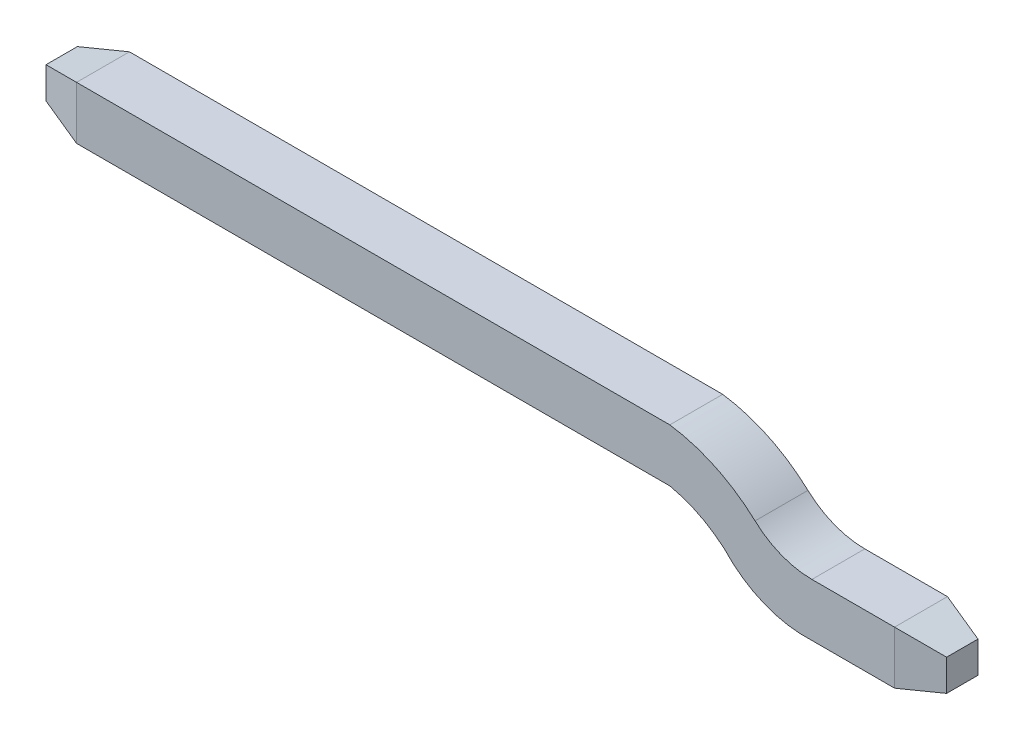
ISO-10303-21;
HEADER;
FILE_DESCRIPTION(('STEP AP214'),'2;1');
FILE_NAME('part.step','',(''),(''),'','','');
FILE_SCHEMA(('AUTOMOTIVE_DESIGN { 1 0 10303 214 1 1 1 1 }'));
ENDSEC;
DATA;
#1=APPLICATION_CONTEXT('core data for automotive mechanical design processes');
#2=APPLICATION_PROTOCOL_DEFINITION('international standard','automotive_design',2000,#1);
#3=PRODUCT_CONTEXT('',#1,'mechanical');
#4=PRODUCT('Part','Part','',(#3));
#5=PRODUCT_RELATED_PRODUCT_CATEGORY('part','',(#4));
#6=PRODUCT_DEFINITION_FORMATION('','',#4);
#7=PRODUCT_DEFINITION_CONTEXT('part definition',#1,'design');
#8=PRODUCT_DEFINITION('design','',#6,#7);
#9=PRODUCT_DEFINITION_SHAPE('','',#8);
#10=(LENGTH_UNIT() NAMED_UNIT(*) SI_UNIT(.MILLI.,.METRE.));
#11=(NAMED_UNIT(*) PLANE_ANGLE_UNIT() SI_UNIT($,.RADIAN.));
#12=(NAMED_UNIT(*) SI_UNIT($,.STERADIAN.) SOLID_ANGLE_UNIT());
#13=UNCERTAINTY_MEASURE_WITH_UNIT(LENGTH_MEASURE(1.E-05),#10,'distance_accuracy_value','');
#14=(GEOMETRIC_REPRESENTATION_CONTEXT(3) GLOBAL_UNCERTAINTY_ASSIGNED_CONTEXT((#13)) GLOBAL_UNIT_ASSIGNED_CONTEXT((#10,
#11,#12)) REPRESENTATION_CONTEXT('',''));
#15=CARTESIAN_POINT('',(0.,0.,0.));
#16=DIRECTION('',(0.,0.,1.));
#17=DIRECTION('',(1.,0.,0.));
#18=AXIS2_PLACEMENT_3D('',#15,#16,#17);
#19=CARTESIAN_POINT('',(0.,0.64,0.13));
#20=DIRECTION('',(-0.251633851765063,0.,-0.967822506788243));
#21=DIRECTION('',(-0.967822506788243,0.,0.251633851765063));
#22=AXIS2_PLACEMENT_3D('',#19,#20,#21);
#23=PLANE('',#22);
#24=DIRECTION('',(-0.938563819722819,0.244026593128049,0.24402659312794));
#25=VECTOR('',#24,1.);
#26=CARTESIAN_POINT('',(0.5,0.,0.));
#27=LINE('',#26,#25);
#28=CARTESIAN_POINT('',(0.5,0.,0.));
#29=VERTEX_POINT('',#28);
#30=CARTESIAN_POINT('',(0.,0.130000000000039,0.13));
#31=VERTEX_POINT('',#30);
#32=EDGE_CURVE('E157',#29,#31,#27,.T.);
#33=ORIENTED_EDGE('',*,*,#32,.T.);
#34=DIRECTION('',(0.,1.,0.));
#35=VECTOR('',#34,1.);
#36=CARTESIAN_POINT('',(0.,0.64,0.13));
#37=LINE('',#36,#35);
#38=CARTESIAN_POINT('',(0.,0.51,0.13));
#39=VERTEX_POINT('',#38);
#40=EDGE_CURVE('E173',#31,#39,#37,.T.);
#41=ORIENTED_EDGE('',*,*,#40,.T.);
#42=DIRECTION('',(0.938563819722819,0.244026593128049,-0.24402659312794));
#43=VECTOR('',#42,1.);
#44=CARTESIAN_POINT('',(0.,0.51,0.13));
#45=LINE('',#44,#43);
#46=CARTESIAN_POINT('',(0.499999999999996,0.640000000000015,0.));
#47=VERTEX_POINT('',#46);
#48=EDGE_CURVE('E146',#39,#47,#45,.T.);
#49=ORIENTED_EDGE('',*,*,#48,.T.);
#50=DIRECTION('',(0.,1.,0.));
#51=VECTOR('',#50,1.);
#52=CARTESIAN_POINT('',(0.5,0.583183016042,0.));
#53=LINE('',#52,#51);
#54=EDGE_CURVE('E144',#29,#47,#53,.T.);
#55=ORIENTED_EDGE('',*,*,#54,.F.);
#56=EDGE_LOOP('',(#33,#41,#49,#55));
#57=FACE_BOUND('',#56,.T.);
#58=ADVANCED_FACE('F17',(#57),#23,.T.);
#59=CARTESIAN_POINT('',(10.9,-0.76,0.13));
#60=DIRECTION('',(0.251633851765063,0.,-0.967822506788243));
#61=DIRECTION('',(-0.967822506788243,0.,-0.251633851765063));
#62=AXIS2_PLACEMENT_3D('',#59,#60,#61);
#63=PLANE('',#62);
#64=DIRECTION('',(-0.938563819722819,-0.244026593128049,-0.244026593127941));
#65=VECTOR('',#64,1.);
#66=CARTESIAN_POINT('',(10.9,-0.63,0.13));
#67=LINE('',#66,#65);
#68=CARTESIAN_POINT('',(10.9,-0.63,0.13));
#69=VERTEX_POINT('',#68);
#70=CARTESIAN_POINT('',(10.4,-0.760000000000015,0.));
#71=VERTEX_POINT('',#70);
#72=EDGE_CURVE('E192',#69,#71,#67,.T.);
#73=ORIENTED_EDGE('',*,*,#72,.T.);
#74=DIRECTION('',(0.,1.,0.));
#75=VECTOR('',#74,1.);
#76=CARTESIAN_POINT('',(10.4,0.583183016042,0.));
#77=LINE('',#76,#75);
#78=CARTESIAN_POINT('',(10.4,-0.12,0.));
#79=VERTEX_POINT('',#78);
#80=EDGE_CURVE('E126',#79,#71,#77,.F.);
#81=ORIENTED_EDGE('',*,*,#80,.F.);
#82=DIRECTION('',(0.938563819722819,-0.244026593128049,0.244026593127941));
#83=VECTOR('',#82,1.);
#84=CARTESIAN_POINT('',(10.4,-0.12,0.));
#85=LINE('',#84,#83);
#86=CARTESIAN_POINT('',(10.9,-0.250000000000038,0.13));
#87=VERTEX_POINT('',#86);
#88=EDGE_CURVE('E201',#79,#87,#85,.T.);
#89=ORIENTED_EDGE('',*,*,#88,.T.);
#90=DIRECTION('',(0.,1.,0.));
#91=VECTOR('',#90,1.);
#92=CARTESIAN_POINT('',(10.9,-0.76,0.13));
#93=LINE('',#92,#91);
#94=EDGE_CURVE('E202',#87,#69,#93,.F.);
#95=ORIENTED_EDGE('',*,*,#94,.T.);
#96=EDGE_LOOP('',(#73,#81,#89,#95));
#97=FACE_BOUND('',#96,.T.);
#98=ADVANCED_FACE('F347',(#97),#63,.T.);
#99=CARTESIAN_POINT('',(10.9,-0.76,0.64));
#100=DIRECTION('',(-1.,0.,0.));
#101=DIRECTION('',(0.,0.,1.));
#102=AXIS2_PLACEMENT_3D('',#99,#100,#101);
#103=PLANE('',#102);
#104=DIRECTION('',(0.,0.,1.));
#105=VECTOR('',#104,1.);
#106=CARTESIAN_POINT('',(10.9,-0.63,0.64));
#107=LINE('',#106,#105);
#108=CARTESIAN_POINT('',(10.9,-0.63,0.509999999999942));
#109=VERTEX_POINT('',#108);
#110=EDGE_CURVE('E195',#109,#69,#107,.F.);
#111=ORIENTED_EDGE('',*,*,#110,.T.);
#112=ORIENTED_EDGE('',*,*,#94,.F.);
#113=DIRECTION('',(0.,0.,1.));
#114=VECTOR('',#113,1.);
#115=CARTESIAN_POINT('',(10.9,-0.250000000000058,0.64));
#116=LINE('',#115,#114);
#117=CARTESIAN_POINT('',(10.9,-0.250000000000019,0.509999999999942));
#118=VERTEX_POINT('',#117);
#119=EDGE_CURVE('E198',#87,#118,#116,.T.);
#120=ORIENTED_EDGE('',*,*,#119,.T.);
#121=DIRECTION('',(0.,1.,0.));
#122=VECTOR('',#121,1.);
#123=CARTESIAN_POINT('',(10.9,0.583183016042,0.509999999999942));
#124=LINE('',#123,#122);
#125=EDGE_CURVE('E205',#118,#109,#124,.F.);
#126=ORIENTED_EDGE('',*,*,#125,.T.);
#127=EDGE_LOOP('',(#111,#112,#120,#126));
#128=FACE_BOUND('',#127,.T.);
#129=ADVANCED_FACE('F345',(#128),#103,.F.);
#130=CARTESIAN_POINT('',(10.4,-0.12,0.64));
#131=DIRECTION('',(-0.251633851765063,-0.967822506788243,0.));
#132=DIRECTION('',(0.967822506788243,-0.251633851765063,0.));
#133=AXIS2_PLACEMENT_3D('',#130,#131,#132);
#134=PLANE('',#133);
#135=DIRECTION('',(0.,0.,1.));
#136=VECTOR('',#135,1.);
#137=CARTESIAN_POINT('',(10.4,-0.12,0.64));
#138=LINE('',#137,#136);
#139=CARTESIAN_POINT('',(10.4,-0.12,0.64));
#140=VERTEX_POINT('',#139);
#141=EDGE_CURVE('E209',#79,#140,#138,.T.);
#142=ORIENTED_EDGE('',*,*,#141,.T.);
#143=DIRECTION('',(0.938563819722819,-0.244026593127941,-0.244026593128049));
#144=VECTOR('',#143,1.);
#145=CARTESIAN_POINT('',(10.4,-0.12,0.64));
#146=LINE('',#145,#144);
#147=EDGE_CURVE('E256',#140,#118,#146,.T.);
#148=ORIENTED_EDGE('',*,*,#147,.T.);
#149=ORIENTED_EDGE('',*,*,#119,.F.);
#150=ORIENTED_EDGE('',*,*,#88,.F.);
#151=EDGE_LOOP('',(#142,#148,#149,#150));
#152=FACE_BOUND('',#151,.T.);
#153=ADVANCED_FACE('F276',(#152),#134,.F.);
#154=CARTESIAN_POINT('',(10.9,-0.63,0.64));
#155=DIRECTION('',(-0.251633851765063,0.967822506788243,0.));
#156=DIRECTION('',(-0.967822506788243,-0.251633851765063,0.));
#157=AXIS2_PLACEMENT_3D('',#154,#155,#156);
#158=PLANE('',#157);
#159=DIRECTION('',(0.,0.,1.));
#160=VECTOR('',#159,1.);
#161=CARTESIAN_POINT('',(10.4,-0.76,0.64));
#162=LINE('',#161,#160);
#163=CARTESIAN_POINT('',(10.4,-0.76,0.64));
#164=VERTEX_POINT('',#163);
#165=EDGE_CURVE('E186',#164,#71,#162,.F.);
#166=ORIENTED_EDGE('',*,*,#165,.T.);
#167=ORIENTED_EDGE('',*,*,#72,.F.);
#168=ORIENTED_EDGE('',*,*,#110,.F.);
#169=DIRECTION('',(-0.938563819722819,-0.244026593127941,0.244026593128049));
#170=VECTOR('',#169,1.);
#171=CARTESIAN_POINT('',(10.9,-0.63,0.509999999999942));
#172=LINE('',#171,#170);
#173=EDGE_CURVE('E208',#109,#164,#172,.T.);
#174=ORIENTED_EDGE('',*,*,#173,.T.);
#175=EDGE_LOOP('',(#166,#167,#168,#174));
#176=FACE_BOUND('',#175,.T.);
#177=ADVANCED_FACE('F342',(#176),#158,.F.);
#178=CARTESIAN_POINT('',(0.,0.64,0.64));
#179=DIRECTION('',(1.,0.,0.));
#180=DIRECTION('',(0.,1.,0.));
#181=AXIS2_PLACEMENT_3D('',#178,#179,#180);
#182=PLANE('',#181);
#183=ORIENTED_EDGE('',*,*,#40,.F.);
#184=DIRECTION('',(0.,0.,1.));
#185=VECTOR('',#184,1.);
#186=CARTESIAN_POINT('',(0.,0.130000000000058,0.64));
#187=LINE('',#186,#185);
#188=CARTESIAN_POINT('',(0.,0.130000000000019,0.509999999999942));
#189=VERTEX_POINT('',#188);
#190=EDGE_CURVE('E154',#31,#189,#187,.T.);
#191=ORIENTED_EDGE('',*,*,#190,.T.);
#192=DIRECTION('',(0.,1.,0.));
#193=VECTOR('',#192,1.);
#194=CARTESIAN_POINT('',(0.,0.583183016042,0.509999999999942));
#195=LINE('',#194,#193);
#196=CARTESIAN_POINT('',(0.,0.51,0.509999999999942));
#197=VERTEX_POINT('',#196);
#198=EDGE_CURVE('E160',#189,#197,#195,.T.);
#199=ORIENTED_EDGE('',*,*,#198,.T.);
#200=DIRECTION('',(0.,0.,1.));
#201=VECTOR('',#200,1.);
#202=CARTESIAN_POINT('',(0.,0.51,0.64));
#203=LINE('',#202,#201);
#204=EDGE_CURVE('E151',#197,#39,#203,.F.);
#205=ORIENTED_EDGE('',*,*,#204,.T.);
#206=EDGE_LOOP('',(#183,#191,#199,#205));
#207=FACE_BOUND('',#206,.T.);
#208=ADVANCED_FACE('F467',(#207),#182,.F.);
#209=CARTESIAN_POINT('',(0.5,0.,0.64));
#210=DIRECTION('',(0.251633851765063,0.967822506788243,0.));
#211=DIRECTION('',(-0.967822506788243,0.251633851765063,0.));
#212=AXIS2_PLACEMENT_3D('',#209,#210,#211);
#213=PLANE('',#212);
#214=ORIENTED_EDGE('',*,*,#190,.F.);
#215=ORIENTED_EDGE('',*,*,#32,.F.);
#216=DIRECTION('',(0.,0.,1.));
#217=VECTOR('',#216,1.);
#218=CARTESIAN_POINT('',(0.5,0.,0.64));
#219=LINE('',#218,#217);
#220=CARTESIAN_POINT('',(0.5,0.,0.64));
#221=VERTEX_POINT('',#220);
#222=EDGE_CURVE('E164',#29,#221,#219,.T.);
#223=ORIENTED_EDGE('',*,*,#222,.T.);
#224=DIRECTION('',(-0.938563819722819,0.24402659312794,-0.244026593128049));
#225=VECTOR('',#224,1.);
#226=CARTESIAN_POINT('',(0.5,0.,0.64));
#227=LINE('',#226,#225);
#228=EDGE_CURVE('E299',#221,#189,#227,.T.);
#229=ORIENTED_EDGE('',*,*,#228,.T.);
#230=EDGE_LOOP('',(#214,#215,#223,#229));
#231=FACE_BOUND('',#230,.T.);
#232=ADVANCED_FACE('F321',(#231),#213,.F.);
#233=CARTESIAN_POINT('',(0.,0.51,0.64));
#234=DIRECTION('',(0.251633851765063,-0.967822506788243,0.));
#235=DIRECTION('',(0.967822506788243,0.251633851765063,0.));
#236=AXIS2_PLACEMENT_3D('',#233,#234,#235);
#237=PLANE('',#236);
#238=DIRECTION('',(0.,0.,1.));
#239=VECTOR('',#238,1.);
#240=CARTESIAN_POINT('',(0.5,0.64,0.64));
#241=LINE('',#240,#239);
#242=CARTESIAN_POINT('',(0.5,0.64,0.64));
#243=VERTEX_POINT('',#242);
#244=EDGE_CURVE('E34',#243,#47,#241,.F.);
#245=ORIENTED_EDGE('',*,*,#244,.T.);
#246=ORIENTED_EDGE('',*,*,#48,.F.);
#247=ORIENTED_EDGE('',*,*,#204,.F.);
#248=DIRECTION('',(0.938563819722819,0.24402659312794,0.244026593128049));
#249=VECTOR('',#248,1.);
#250=CARTESIAN_POINT('',(0.,0.51,0.509999999999942));
#251=LINE('',#250,#249);
#252=EDGE_CURVE('E163',#197,#243,#251,.T.);
#253=ORIENTED_EDGE('',*,*,#252,.T.);
#254=EDGE_LOOP('',(#245,#246,#247,#253));
#255=FACE_BOUND('',#254,.T.);
#256=ADVANCED_FACE('F451',(#255),#237,.F.);
#257=CARTESIAN_POINT('',(9.328387633986,0.583183016042,0.));
#258=DIRECTION('',(0.,0.,-1.));
#259=DIRECTION('',(-1.,0.,0.));
#260=AXIS2_PLACEMENT_3D('',#257,#258,#259);
#261=PLANE('',#260);
#262=CARTESIAN_POINT('',(9.328387633986,0.583183016042,0.));
#263=DIRECTION('',(0.,0.,-1.));
#264=DIRECTION('',(-1.,0.,0.));
#265=AXIS2_PLACEMENT_3D('',#262,#263,#264);
#266=CIRCLE('',#265,1.345090683021);
#267=CARTESIAN_POINT('',(8.44824054463188,-0.433974811756826,0.));
#268=VERTEX_POINT('',#267);
#269=CARTESIAN_POINT('',(9.40000000000033,-0.760000000000018,0.));
#270=VERTEX_POINT('',#269);
#271=EDGE_CURVE('E185',#268,#270,#266,.F.);
#272=ORIENTED_EDGE('',*,*,#271,.F.);
#273=CARTESIAN_POINT('',(7.376092966106,-1.434962408403,0.));
#274=DIRECTION('',(0.,0.,-1.));
#275=DIRECTION('',(-1.,0.,0.));
#276=AXIS2_PLACEMENT_3D('',#273,#274,#275);
#277=CIRCLE('',#276,1.466791259443);
#278=CARTESIAN_POINT('',(7.67999999999868,0.,0.));
#279=VERTEX_POINT('',#278);
#280=EDGE_CURVE('E242',#268,#279,#277,.F.);
#281=ORIENTED_EDGE('',*,*,#280,.T.);
#282=DIRECTION('',(1.,0.,0.));
#283=VECTOR('',#282,1.);
#284=CARTESIAN_POINT('',(0.,0.,0.));
#285=LINE('',#284,#283);
#286=EDGE_CURVE('E176',#279,#29,#285,.F.);
#287=ORIENTED_EDGE('',*,*,#286,.T.);
#288=ORIENTED_EDGE('',*,*,#54,.T.);
#289=DIRECTION('',(1.,0.,0.));
#290=VECTOR('',#289,1.);
#291=CARTESIAN_POINT('',(0.,0.64,0.));
#292=LINE('',#291,#290);
#293=CARTESIAN_POINT('',(7.6799999999997,0.640000000000001,0.));
#294=VERTEX_POINT('',#293);
#295=EDGE_CURVE('E120',#47,#294,#292,.T.);
#296=ORIENTED_EDGE('',*,*,#295,.T.);
#297=CARTESIAN_POINT('',(7.407807708896,-1.262382662351,0.));
#298=DIRECTION('',(0.,0.,-1.));
#299=DIRECTION('',(-1.,0.,0.));
#300=AXIS2_PLACEMENT_3D('',#297,#298,#299);
#301=CIRCLE('',#300,1.921756602005);
#302=CARTESIAN_POINT('',(8.71186119399857,0.14920968154378,0.));
#303=VERTEX_POINT('',#302);
#304=EDGE_CURVE('E20',#303,#294,#301,.F.);
#305=ORIENTED_EDGE('',*,*,#304,.F.);
#306=CARTESIAN_POINT('',(9.4,0.894095900695,0.));
#307=DIRECTION('',(0.,0.,-1.));
#308=DIRECTION('',(-1.,0.,0.));
#309=AXIS2_PLACEMENT_3D('',#306,#307,#308);
#310=CIRCLE('',#309,1.014095900695);
#311=CARTESIAN_POINT('',(9.4,-0.12,0.));
#312=VERTEX_POINT('',#311);
#313=EDGE_CURVE('E118',#303,#312,#310,.F.);
#314=ORIENTED_EDGE('',*,*,#313,.T.);
#315=DIRECTION('',(1.,0.,0.));
#316=VECTOR('',#315,1.);
#317=CARTESIAN_POINT('',(10.9,-0.12,0.));
#318=LINE('',#317,#316);
#319=EDGE_CURVE('E220',#312,#79,#318,.T.);
#320=ORIENTED_EDGE('',*,*,#319,.T.);
#321=ORIENTED_EDGE('',*,*,#80,.T.);
#322=DIRECTION('',(-1.,0.,0.));
#323=VECTOR('',#322,1.);
#324=CARTESIAN_POINT('',(10.9,-0.76,0.));
#325=LINE('',#324,#323);
#326=EDGE_CURVE('E182',#71,#270,#325,.T.);
#327=ORIENTED_EDGE('',*,*,#326,.T.);
#328=EDGE_LOOP('',(#272,#281,#287,#288,#296,#305,#314,#320,#321,#327));
#329=FACE_BOUND('',#328,.T.);
#330=ADVANCED_FACE('F116',(#329),#261,.T.);
#331=CARTESIAN_POINT('',(7.407807708896,-1.262382662351,0.64));
#332=DIRECTION('',(0.,0.,-1.));
#333=DIRECTION('',(-1.,0.,0.));
#334=AXIS2_PLACEMENT_3D('',#331,#332,#333);
#335=CYLINDRICAL_SURFACE('',#334,1.921756602005);
#336=CARTESIAN_POINT('',(7.407807708896,-1.262382662351,0.64));
#337=DIRECTION('',(0.,0.,-1.));
#338=DIRECTION('',(-1.,0.,0.));
#339=AXIS2_PLACEMENT_3D('',#336,#337,#338);
#340=CIRCLE('',#339,1.921756602005);
#341=CARTESIAN_POINT('',(7.67999999999971,0.640000000000001,0.64));
#342=VERTEX_POINT('',#341);
#343=CARTESIAN_POINT('',(8.71186119399857,0.14920968154378,0.64));
#344=VERTEX_POINT('',#343);
#345=EDGE_CURVE('E135',#342,#344,#340,.T.);
#346=ORIENTED_EDGE('',*,*,#345,.T.);
#347=DIRECTION('',(0.,0.,-1.));
#348=VECTOR('',#347,1.);
#349=CARTESIAN_POINT('',(8.71186119399872,0.149209681543692,0.64));
#350=LINE('',#349,#348);
#351=EDGE_CURVE('E125',#344,#303,#350,.T.);
#352=ORIENTED_EDGE('',*,*,#351,.T.);
#353=ORIENTED_EDGE('',*,*,#304,.T.);
#354=DIRECTION('',(0.,0.,1.));
#355=VECTOR('',#354,1.);
#356=CARTESIAN_POINT('',(7.68,0.640000000000001,0.64));
#357=LINE('',#356,#355);
#358=EDGE_CURVE('E297',#294,#342,#357,.T.);
#359=ORIENTED_EDGE('',*,*,#358,.T.);
#360=EDGE_LOOP('',(#346,#352,#353,#359));
#361=FACE_BOUND('',#360,.T.);
#362=ADVANCED_FACE('F134',(#361),#335,.T.);
#363=CARTESIAN_POINT('',(9.4,0.894095900695,0.64));
#364=DIRECTION('',(0.,0.,-1.));
#365=DIRECTION('',(-1.,0.,0.));
#366=AXIS2_PLACEMENT_3D('',#363,#364,#365);
#367=CYLINDRICAL_SURFACE('',#366,1.014095900695);
#368=ORIENTED_EDGE('',*,*,#351,.F.);
#369=CARTESIAN_POINT('',(9.4,0.894095900695,0.64));
#370=DIRECTION('',(0.,0.,-1.));
#371=DIRECTION('',(-1.,0.,0.));
#372=AXIS2_PLACEMENT_3D('',#369,#370,#371);
#373=CIRCLE('',#372,1.014095900695);
#374=CARTESIAN_POINT('',(9.4,-0.12,0.64));
#375=VERTEX_POINT('',#374);
#376=EDGE_CURVE('E238',#344,#375,#373,.F.);
#377=ORIENTED_EDGE('',*,*,#376,.T.);
#378=DIRECTION('',(0.,0.,1.));
#379=VECTOR('',#378,1.);
#380=CARTESIAN_POINT('',(9.4,-0.12,0.64));
#381=LINE('',#380,#379);
#382=EDGE_CURVE('E132',#375,#312,#381,.F.);
#383=ORIENTED_EDGE('',*,*,#382,.T.);
#384=ORIENTED_EDGE('',*,*,#313,.F.);
#385=EDGE_LOOP('',(#368,#377,#383,#384));
#386=FACE_BOUND('',#385,.T.);
#387=ADVANCED_FACE('F129',(#386),#367,.F.);
#388=CARTESIAN_POINT('',(10.9,-0.12,0.64));
#389=DIRECTION('',(0.,-1.,0.));
#390=DIRECTION('',(1.,0.,0.));
#391=AXIS2_PLACEMENT_3D('',#388,#389,#390);
#392=PLANE('',#391);
#393=ORIENTED_EDGE('',*,*,#141,.F.);
#394=ORIENTED_EDGE('',*,*,#319,.F.);
#395=ORIENTED_EDGE('',*,*,#382,.F.);
#396=DIRECTION('',(-1.,0.,0.));
#397=VECTOR('',#396,1.);
#398=CARTESIAN_POINT('',(9.328387633986,-0.12,0.64));
#399=LINE('',#398,#397);
#400=EDGE_CURVE('E240',#375,#140,#399,.F.);
#401=ORIENTED_EDGE('',*,*,#400,.T.);
#402=EDGE_LOOP('',(#393,#394,#395,#401));
#403=FACE_BOUND('',#402,.T.);
#404=ADVANCED_FACE('F289',(#403),#392,.F.);
#405=CARTESIAN_POINT('',(10.4,0.583183016042,0.64));
#406=DIRECTION('',(-0.251633851765063,0.,-0.967822506788243));
#407=DIRECTION('',(-0.967822506788243,0.,0.251633851765063));
#408=AXIS2_PLACEMENT_3D('',#405,#406,#407);
#409=PLANE('',#408);
#410=DIRECTION('',(0.,1.,0.));
#411=VECTOR('',#410,1.);
#412=CARTESIAN_POINT('',(10.4,0.583183016042,0.64));
#413=LINE('',#412,#411);
#414=EDGE_CURVE('E259',#140,#164,#413,.F.);
#415=ORIENTED_EDGE('',*,*,#414,.T.);
#416=ORIENTED_EDGE('',*,*,#173,.F.);
#417=ORIENTED_EDGE('',*,*,#125,.F.);
#418=ORIENTED_EDGE('',*,*,#147,.F.);
#419=EDGE_LOOP('',(#415,#416,#417,#418));
#420=FACE_BOUND('',#419,.T.);
#421=ADVANCED_FACE('F343',(#420),#409,.F.);
#422=CARTESIAN_POINT('',(10.9,-0.76,0.64));
#423=DIRECTION('',(0.,1.,0.));
#424=DIRECTION('',(-1.,0.,0.));
#425=AXIS2_PLACEMENT_3D('',#422,#423,#424);
#426=PLANE('',#425);
#427=ORIENTED_EDGE('',*,*,#165,.F.);
#428=DIRECTION('',(-1.,0.,0.));
#429=VECTOR('',#428,1.);
#430=CARTESIAN_POINT('',(9.328387633986,-0.76,0.64));
#431=LINE('',#430,#429);
#432=CARTESIAN_POINT('',(9.40000000000033,-0.760000000000018,0.64));
#433=VERTEX_POINT('',#432);
#434=EDGE_CURVE('E237',#164,#433,#431,.T.);
#435=ORIENTED_EDGE('',*,*,#434,.T.);
#436=DIRECTION('',(0.,0.,-1.));
#437=VECTOR('',#436,1.);
#438=CARTESIAN_POINT('',(9.4,-0.760000000000035,0.64));
#439=LINE('',#438,#437);
#440=EDGE_CURVE('E245',#270,#433,#439,.F.);
#441=ORIENTED_EDGE('',*,*,#440,.F.);
#442=ORIENTED_EDGE('',*,*,#326,.F.);
#443=EDGE_LOOP('',(#427,#435,#441,#442));
#444=FACE_BOUND('',#443,.T.);
#445=ADVANCED_FACE('F338',(#444),#426,.F.);
#446=CARTESIAN_POINT('',(9.328387633986,0.583183016042,0.64));
#447=DIRECTION('',(0.,0.,-1.));
#448=DIRECTION('',(-1.,0.,0.));
#449=AXIS2_PLACEMENT_3D('',#446,#447,#448);
#450=CYLINDRICAL_SURFACE('',#449,1.345090683021);
#451=CARTESIAN_POINT('',(9.328387633986,0.583183016042,0.64));
#452=DIRECTION('',(0.,0.,-1.));
#453=DIRECTION('',(-1.,0.,0.));
#454=AXIS2_PLACEMENT_3D('',#451,#452,#453);
#455=CIRCLE('',#454,1.345090683021);
#456=CARTESIAN_POINT('',(8.44824054463188,-0.433974811756826,0.64));
#457=VERTEX_POINT('',#456);
#458=EDGE_CURVE('E234',#433,#457,#455,.T.);
#459=ORIENTED_EDGE('',*,*,#458,.T.);
#460=DIRECTION('',(0.,0.,-1.));
#461=VECTOR('',#460,1.);
#462=CARTESIAN_POINT('',(8.44824054463442,-0.433974811759547,0.64));
#463=LINE('',#462,#461);
#464=EDGE_CURVE('E244',#457,#268,#463,.T.);
#465=ORIENTED_EDGE('',*,*,#464,.T.);
#466=ORIENTED_EDGE('',*,*,#271,.T.);
#467=ORIENTED_EDGE('',*,*,#440,.T.);
#468=EDGE_LOOP('',(#459,#465,#466,#467));
#469=FACE_BOUND('',#468,.T.);
#470=ADVANCED_FACE('F351',(#469),#450,.T.);
#471=CARTESIAN_POINT('',(7.376092966106,-1.434962408403,0.64));
#472=DIRECTION('',(0.,0.,-1.));
#473=DIRECTION('',(-1.,0.,0.));
#474=AXIS2_PLACEMENT_3D('',#471,#472,#473);
#475=CYLINDRICAL_SURFACE('',#474,1.466791259443);
#476=ORIENTED_EDGE('',*,*,#464,.F.);
#477=CARTESIAN_POINT('',(7.376092966106,-1.434962408403,0.64));
#478=DIRECTION('',(0.,0.,-1.));
#479=DIRECTION('',(-1.,0.,0.));
#480=AXIS2_PLACEMENT_3D('',#477,#478,#479);
#481=CIRCLE('',#480,1.466791259443);
#482=CARTESIAN_POINT('',(7.67999999999868,0.,0.64));
#483=VERTEX_POINT('',#482);
#484=EDGE_CURVE('E230',#457,#483,#481,.F.);
#485=ORIENTED_EDGE('',*,*,#484,.T.);
#486=DIRECTION('',(0.,0.,1.));
#487=VECTOR('',#486,1.);
#488=CARTESIAN_POINT('',(7.68,0.,0.64));
#489=LINE('',#488,#487);
#490=EDGE_CURVE('E179',#483,#279,#489,.F.);
#491=ORIENTED_EDGE('',*,*,#490,.T.);
#492=ORIENTED_EDGE('',*,*,#280,.F.);
#493=EDGE_LOOP('',(#476,#485,#491,#492));
#494=FACE_BOUND('',#493,.T.);
#495=ADVANCED_FACE('F350',(#494),#475,.F.);
#496=CARTESIAN_POINT('',(0.,0.,0.64));
#497=DIRECTION('',(0.,1.,0.));
#498=DIRECTION('',(0.,0.,1.));
#499=AXIS2_PLACEMENT_3D('',#496,#497,#498);
#500=PLANE('',#499);
#501=ORIENTED_EDGE('',*,*,#222,.F.);
#502=ORIENTED_EDGE('',*,*,#286,.F.);
#503=ORIENTED_EDGE('',*,*,#490,.F.);
#504=DIRECTION('',(-1.,0.,0.));
#505=VECTOR('',#504,1.);
#506=CARTESIAN_POINT('',(9.328387633986,0.,0.64));
#507=LINE('',#506,#505);
#508=EDGE_CURVE('E233',#483,#221,#507,.T.);
#509=ORIENTED_EDGE('',*,*,#508,.T.);
#510=EDGE_LOOP('',(#501,#502,#503,#509));
#511=FACE_BOUND('',#510,.T.);
#512=ADVANCED_FACE('F331',(#511),#500,.F.);
#513=CARTESIAN_POINT('',(0.5,0.583183016042,0.64));
#514=DIRECTION('',(0.251633851765063,0.,-0.967822506788243));
#515=DIRECTION('',(-0.967822506788243,0.,-0.251633851765063));
#516=AXIS2_PLACEMENT_3D('',#513,#514,#515);
#517=PLANE('',#516);
#518=DIRECTION('',(0.,1.,0.));
#519=VECTOR('',#518,1.);
#520=CARTESIAN_POINT('',(0.5,0.583183016042,0.64));
#521=LINE('',#520,#519);
#522=EDGE_CURVE('E26',#221,#243,#521,.T.);
#523=ORIENTED_EDGE('',*,*,#522,.T.);
#524=ORIENTED_EDGE('',*,*,#252,.F.);
#525=ORIENTED_EDGE('',*,*,#198,.F.);
#526=ORIENTED_EDGE('',*,*,#228,.F.);
#527=EDGE_LOOP('',(#523,#524,#525,#526));
#528=FACE_BOUND('',#527,.T.);
#529=ADVANCED_FACE('F367',(#528),#517,.F.);
#530=CARTESIAN_POINT('',(0.,0.64,0.64));
#531=DIRECTION('',(0.,-1.,0.));
#532=DIRECTION('',(1.,0.,0.));
#533=AXIS2_PLACEMENT_3D('',#530,#531,#532);
#534=PLANE('',#533);
#535=ORIENTED_EDGE('',*,*,#244,.F.);
#536=DIRECTION('',(-1.,0.,0.));
#537=VECTOR('',#536,1.);
#538=CARTESIAN_POINT('',(9.328387633986,0.64,0.64));
#539=LINE('',#538,#537);
#540=EDGE_CURVE('E11',#243,#342,#539,.F.);
#541=ORIENTED_EDGE('',*,*,#540,.T.);
#542=ORIENTED_EDGE('',*,*,#358,.F.);
#543=ORIENTED_EDGE('',*,*,#295,.F.);
#544=EDGE_LOOP('',(#535,#541,#542,#543));
#545=FACE_BOUND('',#544,.T.);
#546=ADVANCED_FACE('F362',(#545),#534,.F.);
#547=CARTESIAN_POINT('',(9.328387633986,0.583183016042,0.64));
#548=DIRECTION('',(0.,0.,-1.));
#549=DIRECTION('',(-1.,0.,0.));
#550=AXIS2_PLACEMENT_3D('',#547,#548,#549);
#551=PLANE('',#550);
#552=ORIENTED_EDGE('',*,*,#522,.F.);
#553=ORIENTED_EDGE('',*,*,#508,.F.);
#554=ORIENTED_EDGE('',*,*,#484,.F.);
#555=ORIENTED_EDGE('',*,*,#458,.F.);
#556=ORIENTED_EDGE('',*,*,#434,.F.);
#557=ORIENTED_EDGE('',*,*,#414,.F.);
#558=ORIENTED_EDGE('',*,*,#400,.F.);
#559=ORIENTED_EDGE('',*,*,#376,.F.);
#560=ORIENTED_EDGE('',*,*,#345,.F.);
#561=ORIENTED_EDGE('',*,*,#540,.F.);
#562=EDGE_LOOP('',(#552,#553,#554,#555,#556,#557,#558,#559,#560,#561));
#563=FACE_BOUND('',#562,.T.);
#564=ADVANCED_FACE('F285',(#563),#551,.F.);
#565=CLOSED_SHELL('',(#58,#98,#129,#153,#177,#208,#232,#256,#330,#362,#387,#404,#421,#445,#470,
#495,#512,#529,#546,#564));
#566=MANIFOLD_SOLID_BREP('B1',#565);
#567=ADVANCED_BREP_SHAPE_REPRESENTATION('',(#18,#566),#14);
#568=SHAPE_DEFINITION_REPRESENTATION(#9,#567);
ENDSEC;
END-ISO-10303-21;
